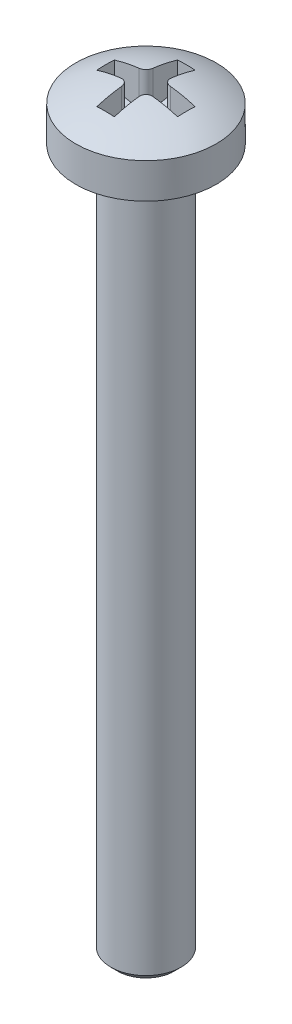
ISO-10303-21;
HEADER;
FILE_DESCRIPTION(('STEP AP214'),'2;1');
FILE_NAME('part.step','',(''),(''),'','','');
FILE_SCHEMA(('AUTOMOTIVE_DESIGN { 1 0 10303 214 1 1 1 1 }'));
ENDSEC;
DATA;
#1=APPLICATION_CONTEXT('core data for automotive mechanical design processes');
#2=APPLICATION_PROTOCOL_DEFINITION('international standard','automotive_design',2000,#1);
#3=PRODUCT_CONTEXT('',#1,'mechanical');
#4=PRODUCT('Part','Part','',(#3));
#5=PRODUCT_RELATED_PRODUCT_CATEGORY('part','',(#4));
#6=PRODUCT_DEFINITION_FORMATION('','',#4);
#7=PRODUCT_DEFINITION_CONTEXT('part definition',#1,'design');
#8=PRODUCT_DEFINITION('design','',#6,#7);
#9=PRODUCT_DEFINITION_SHAPE('','',#8);
#10=(LENGTH_UNIT() NAMED_UNIT(*) SI_UNIT(.MILLI.,.METRE.));
#11=(NAMED_UNIT(*) PLANE_ANGLE_UNIT() SI_UNIT($,.RADIAN.));
#12=(NAMED_UNIT(*) SI_UNIT($,.STERADIAN.) SOLID_ANGLE_UNIT());
#13=UNCERTAINTY_MEASURE_WITH_UNIT(LENGTH_MEASURE(1.E-05),#10,'distance_accuracy_value','');
#14=(GEOMETRIC_REPRESENTATION_CONTEXT(3) GLOBAL_UNCERTAINTY_ASSIGNED_CONTEXT((#13)) GLOBAL_UNIT_ASSIGNED_CONTEXT((#10,
#11,#12)) REPRESENTATION_CONTEXT('',''));
#15=CARTESIAN_POINT('',(0.,0.,0.));
#16=DIRECTION('',(0.,0.,1.));
#17=DIRECTION('',(1.,0.,0.));
#18=AXIS2_PLACEMENT_3D('',#15,#16,#17);
#19=CARTESIAN_POINT('',(2.00000000000001,-40.,0.));
#20=DIRECTION('',(0.,1.,0.));
#21=DIRECTION('',(0.,0.,1.));
#22=AXIS2_PLACEMENT_3D('',#19,#20,#21);
#23=PLANE('',#22);
#24=CARTESIAN_POINT('',(0.,-40.,0.));
#25=DIRECTION('',(0.,1.,0.));
#26=DIRECTION('',(0.,0.,1.));
#27=AXIS2_PLACEMENT_3D('',#24,#25,#26);
#28=CIRCLE('',#27,1.60000000000001);
#29=CARTESIAN_POINT('',(0.,-40.,1.60000000000001));
#30=VERTEX_POINT('',#29);
#31=EDGE_CURVE('E11',#30,#30,#28,.F.);
#32=ORIENTED_EDGE('',*,*,#31,.T.);
#33=EDGE_LOOP('',(#32));
#34=FACE_BOUND('',#33,.T.);
#35=ADVANCED_FACE('F39',(#34),#23,.F.);
#36=CARTESIAN_POINT('',(0.,-4.72272727272728,0.));
#37=DIRECTION('',(0.,1.,0.));
#38=DIRECTION('',(1.,0.,0.));
#39=AXIS2_PLACEMENT_3D('',#36,#37,#38);
#40=SPHERICAL_SURFACE('',#39,7.82272727272728);
#41=CARTESIAN_POINT('',(0.5,-4.72272727272728,0.));
#42=DIRECTION('',(1.,0.,0.));
#43=DIRECTION('',(0.,0.,-1.));
#44=AXIS2_PLACEMENT_3D('',#41,#42,#43);
#45=CIRCLE('',#44,7.80673183755348);
#46=CARTESIAN_POINT('',(0.5,2.73750476008987,-2.3));
#47=VERTEX_POINT('',#46);
#48=CARTESIAN_POINT('',(0.5,3.03195273249996,-0.9));
#49=VERTEX_POINT('',#48);
#50=EDGE_CURVE('E197',#47,#49,#45,.T.);
#51=ORIENTED_EDGE('',*,*,#50,.T.);
#52=CARTESIAN_POINT('',(0.5,3.03195273249996,-0.9));
#53=CARTESIAN_POINT('',(0.499980445653111,3.03454133641409,-0.877715199489853));
#54=CARTESIAN_POINT('',(0.501861325410847,3.0369109081898,-0.855406290685576));
#55=CARTESIAN_POINT('',(0.509308944557218,3.04115309750786,-0.811373363194762));
#56=CARTESIAN_POINT('',(0.514874142284133,3.04302592244948,-0.789649103823202));
#57=CARTESIAN_POINT('',(0.529581237998282,3.04621922226135,-0.747382590966706));
#58=CARTESIAN_POINT('',(0.538725894104163,3.0475392695665,-0.726841263013532));
#59=CARTESIAN_POINT('',(0.560335395409864,3.04958563422558,-0.687561895208892));
#60=CARTESIAN_POINT('',(0.572799188800053,3.05031213937239,-0.668823286645484));
#61=CARTESIAN_POINT('',(0.600596407799792,3.05114682561896,-0.633816736919395));
#62=CARTESIAN_POINT('',(0.615908512897499,3.05125942358876,-0.617531968951503));
#63=CARTESIAN_POINT('',(0.649026593510928,3.0508747494218,-0.587736528915892));
#64=CARTESIAN_POINT('',(0.666832948845617,3.05037738431157,-0.57422628012003));
#65=CARTESIAN_POINT('',(0.704363578386314,3.04879030089852,-0.550401537052683));
#66=CARTESIAN_POINT('',(0.724081674108829,3.04770244181268,-0.540077170971166));
#67=CARTESIAN_POINT('',(0.764919862434989,3.04496752601447,-0.522847557382613));
#68=CARTESIAN_POINT('',(0.786039420133905,3.04332068167708,-0.515941013789886));
#69=CARTESIAN_POINT('',(0.822714805755103,3.04007942212771,-0.5072274099574));
#70=CARTESIAN_POINT('',(0.838074093965798,3.03861284502167,-0.504517057384848));
#71=CARTESIAN_POINT('',(0.868957976534767,3.0354499847468,-0.500903202638105));
#72=CARTESIAN_POINT('',(0.88448230264661,3.03375403356009,-0.499997118337815));
#73=CARTESIAN_POINT('',(0.9,3.03195273249996,-0.5));
#74=B_SPLINE_CURVE_WITH_KNOTS('',3,(#52,#53,#54,#55,#56,#57,#58,#59,#60,#61,#62,#63,#64,#65,#66,
#67,#68,#69,#70,#71,#72,#73),.UNSPECIFIED.,.F.,.F.,(4,2,2,2,2,2,2,2,2,2,4),(0.,
0.0672224170043276,0.134416723302517,0.201662907801201,0.26888780779591,0.335628401088124,
0.402379168562592,0.468920974876219,0.535437528240593,0.582332561709017,0.629160434341086),.UNSPECIFIED.);
#75=CARTESIAN_POINT('',(0.9,3.03195273249996,-0.5));
#76=VERTEX_POINT('',#75);
#77=EDGE_CURVE('E259',#49,#76,#74,.T.);
#78=ORIENTED_EDGE('',*,*,#77,.T.);
#79=CARTESIAN_POINT('',(0.,-4.72272727272728,-0.5));
#80=DIRECTION('',(0.,0.,-1.));
#81=DIRECTION('',(-1.,0.,0.));
#82=AXIS2_PLACEMENT_3D('',#79,#80,#81);
#83=CIRCLE('',#82,7.80673183755348);
#84=CARTESIAN_POINT('',(2.3,2.73750476008987,-0.5));
#85=VERTEX_POINT('',#84);
#86=EDGE_CURVE('E195',#76,#85,#83,.T.);
#87=ORIENTED_EDGE('',*,*,#86,.T.);
#88=CARTESIAN_POINT('',(2.3,-4.72272727272728,0.));
#89=DIRECTION('',(1.,0.,0.));
#90=DIRECTION('',(0.,0.,-1.));
#91=AXIS2_PLACEMENT_3D('',#88,#89,#90);
#92=CIRCLE('',#91,7.47696876972688);
#93=CARTESIAN_POINT('',(2.3,2.73750476008987,0.5));
#94=VERTEX_POINT('',#93);
#95=EDGE_CURVE('E172',#85,#94,#92,.T.);
#96=ORIENTED_EDGE('',*,*,#95,.T.);
#97=CARTESIAN_POINT('',(0.,-4.72272727272728,0.5));
#98=DIRECTION('',(0.,0.,1.));
#99=DIRECTION('',(1.,0.,0.));
#100=AXIS2_PLACEMENT_3D('',#97,#98,#99);
#101=CIRCLE('',#100,7.80673183755348);
#102=CARTESIAN_POINT('',(0.9,3.03195273249996,0.5));
#103=VERTEX_POINT('',#102);
#104=EDGE_CURVE('E221',#94,#103,#101,.T.);
#105=ORIENTED_EDGE('',*,*,#104,.T.);
#106=CARTESIAN_POINT('',(0.9,3.03195273249996,0.5));
#107=CARTESIAN_POINT('',(0.877715199489853,3.03454133641409,0.499980445653111));
#108=CARTESIAN_POINT('',(0.855406290685576,3.0369109081898,0.501861325410847));
#109=CARTESIAN_POINT('',(0.811373363194762,3.04115309750786,0.509308944557218));
#110=CARTESIAN_POINT('',(0.789649103823202,3.04302592244948,0.514874142284133));
#111=CARTESIAN_POINT('',(0.747382590966706,3.04621922226135,0.529581237998282));
#112=CARTESIAN_POINT('',(0.726841263013532,3.0475392695665,0.538725894104163));
#113=CARTESIAN_POINT('',(0.687561895208891,3.04958563422558,0.560335395409864));
#114=CARTESIAN_POINT('',(0.668823286645484,3.05031213937239,0.572799188800053));
#115=CARTESIAN_POINT('',(0.633816736919395,3.05114682561896,0.600596407799792));
#116=CARTESIAN_POINT('',(0.617531968951503,3.05125942358877,0.6159085128975));
#117=CARTESIAN_POINT('',(0.587736528915892,3.0508747494218,0.649026593510929));
#118=CARTESIAN_POINT('',(0.57422628012003,3.05037738431157,0.666832948845617));
#119=CARTESIAN_POINT('',(0.550401537052683,3.04879030089852,0.704363578386314));
#120=CARTESIAN_POINT('',(0.540077170971166,3.04770244181268,0.724081674108829));
#121=CARTESIAN_POINT('',(0.522847557382613,3.04496752601447,0.764919862434989));
#122=CARTESIAN_POINT('',(0.515941013789886,3.04332068167708,0.786039420133905));
#123=CARTESIAN_POINT('',(0.5072274099574,3.04007942212771,0.822714805755103));
#124=CARTESIAN_POINT('',(0.504517057384848,3.03861284502167,0.838074093965798));
#125=CARTESIAN_POINT('',(0.500903202638105,3.03544998474679,0.868957976534767));
#126=CARTESIAN_POINT('',(0.499997118337815,3.03375403356009,0.884482302646609));
#127=CARTESIAN_POINT('',(0.5,3.03195273249996,0.9));
#128=B_SPLINE_CURVE_WITH_KNOTS('',3,(#106,#107,#108,#109,#110,#111,#112,#113,#114,#115,#116,
#117,#118,#119,#120,#121,#122,#123,#124,#125,#126,#127),.UNSPECIFIED.,.F.,.F.,(4,2,2,2,2,2,2,2,
2,2,4),(0.,0.0672224170043276,0.134416723302517,0.201662907801201,0.268887807795911,
0.335628401088124,0.402379168562592,0.468920974876219,0.535437528240593,0.582332561709017,
0.629160434341086),.UNSPECIFIED.);
#129=CARTESIAN_POINT('',(0.5,3.03195273249996,0.9));
#130=VERTEX_POINT('',#129);
#131=EDGE_CURVE('E254',#103,#130,#128,.T.);
#132=ORIENTED_EDGE('',*,*,#131,.T.);
#133=CARTESIAN_POINT('',(0.5,-4.72272727272728,0.));
#134=DIRECTION('',(1.,0.,0.));
#135=DIRECTION('',(0.,0.,-1.));
#136=AXIS2_PLACEMENT_3D('',#133,#134,#135);
#137=CIRCLE('',#136,7.80673183755348);
#138=CARTESIAN_POINT('',(0.5,2.73750476008987,2.3));
#139=VERTEX_POINT('',#138);
#140=EDGE_CURVE('E219',#130,#139,#137,.T.);
#141=ORIENTED_EDGE('',*,*,#140,.T.);
#142=CARTESIAN_POINT('',(0.,-4.72272727272728,2.3));
#143=DIRECTION('',(0.,0.,1.));
#144=DIRECTION('',(1.,0.,0.));
#145=AXIS2_PLACEMENT_3D('',#142,#143,#144);
#146=CIRCLE('',#145,7.47696876972688);
#147=CARTESIAN_POINT('',(-0.5,2.73750476008987,2.3));
#148=VERTEX_POINT('',#147);
#149=EDGE_CURVE('E216',#139,#148,#146,.T.);
#150=ORIENTED_EDGE('',*,*,#149,.T.);
#151=CARTESIAN_POINT('',(-0.5,-4.72272727272728,0.));
#152=DIRECTION('',(-1.,0.,0.));
#153=DIRECTION('',(0.,0.,1.));
#154=AXIS2_PLACEMENT_3D('',#151,#152,#153);
#155=CIRCLE('',#154,7.80673183755348);
#156=CARTESIAN_POINT('',(-0.5,3.03195273249996,0.9));
#157=VERTEX_POINT('',#156);
#158=EDGE_CURVE('E213',#148,#157,#155,.T.);
#159=ORIENTED_EDGE('',*,*,#158,.T.);
#160=CARTESIAN_POINT('',(-0.5,3.03195273249996,0.9));
#161=CARTESIAN_POINT('',(-0.499980445653111,3.03454133641409,0.877715199489853));
#162=CARTESIAN_POINT('',(-0.501861325410847,3.0369109081898,0.855406290685576));
#163=CARTESIAN_POINT('',(-0.509308944557218,3.04115309750786,0.811373363194762));
#164=CARTESIAN_POINT('',(-0.514874142284133,3.04302592244948,0.789649103823202));
#165=CARTESIAN_POINT('',(-0.529581237998282,3.04621922226135,0.747382590966706));
#166=CARTESIAN_POINT('',(-0.538725894104163,3.0475392695665,0.726841263013532));
#167=CARTESIAN_POINT('',(-0.560335395409864,3.04958563422558,0.687561895208892));
#168=CARTESIAN_POINT('',(-0.572799188800053,3.05031213937239,0.668823286645484));
#169=CARTESIAN_POINT('',(-0.600596407799792,3.05114682561896,0.633816736919395));
#170=CARTESIAN_POINT('',(-0.6159085128975,3.05125942358876,0.617531968951503));
#171=CARTESIAN_POINT('',(-0.649026593510929,3.0508747494218,0.587736528915892));
#172=CARTESIAN_POINT('',(-0.666832948845617,3.05037738431157,0.57422628012003));
#173=CARTESIAN_POINT('',(-0.704363578386314,3.04879030089852,0.550401537052683));
#174=CARTESIAN_POINT('',(-0.724081674108829,3.04770244181268,0.540077170971166));
#175=CARTESIAN_POINT('',(-0.764919862434989,3.04496752601447,0.522847557382613));
#176=CARTESIAN_POINT('',(-0.786039420133905,3.04332068167708,0.515941013789887));
#177=CARTESIAN_POINT('',(-0.822714805755103,3.04007942212771,0.5072274099574));
#178=CARTESIAN_POINT('',(-0.838074093965798,3.03861284502167,0.504517057384848));
#179=CARTESIAN_POINT('',(-0.868957976534767,3.0354499847468,0.500903202638105));
#180=CARTESIAN_POINT('',(-0.88448230264661,3.03375403356009,0.499997118337815));
#181=CARTESIAN_POINT('',(-0.9,3.03195273249996,0.5));
#182=B_SPLINE_CURVE_WITH_KNOTS('',3,(#160,#161,#162,#163,#164,#165,#166,#167,#168,#169,#170,
#171,#172,#173,#174,#175,#176,#177,#178,#179,#180,#181),.UNSPECIFIED.,.F.,.F.,(4,2,2,2,2,2,2,2,
2,2,4),(0.,0.0672224170043276,0.134416723302517,0.201662907801201,0.26888780779591,
0.335628401088124,0.402379168562592,0.468920974876219,0.535437528240592,0.582332561709017,
0.629160434341086),.UNSPECIFIED.);
#183=CARTESIAN_POINT('',(-0.9,3.03195273249996,0.5));
#184=VERTEX_POINT('',#183);
#185=EDGE_CURVE('E233',#157,#184,#182,.T.);
#186=ORIENTED_EDGE('',*,*,#185,.T.);
#187=CARTESIAN_POINT('',(0.,-4.72272727272728,0.5));
#188=DIRECTION('',(0.,0.,1.));
#189=DIRECTION('',(1.,0.,0.));
#190=AXIS2_PLACEMENT_3D('',#187,#188,#189);
#191=CIRCLE('',#190,7.80673183755348);
#192=CARTESIAN_POINT('',(-2.3,2.73750476008987,0.5));
#193=VERTEX_POINT('',#192);
#194=EDGE_CURVE('E211',#184,#193,#191,.T.);
#195=ORIENTED_EDGE('',*,*,#194,.T.);
#196=CARTESIAN_POINT('',(-2.3,-4.72272727272728,0.));
#197=DIRECTION('',(-1.,0.,0.));
#198=DIRECTION('',(0.,0.,1.));
#199=AXIS2_PLACEMENT_3D('',#196,#197,#198);
#200=CIRCLE('',#199,7.47696876972688);
#201=CARTESIAN_POINT('',(-2.3,2.73750476008987,-0.5));
#202=VERTEX_POINT('',#201);
#203=EDGE_CURVE('E208',#193,#202,#200,.T.);
#204=ORIENTED_EDGE('',*,*,#203,.T.);
#205=CARTESIAN_POINT('',(0.,-4.72272727272728,-0.5));
#206=DIRECTION('',(0.,0.,-1.));
#207=DIRECTION('',(-1.,0.,0.));
#208=AXIS2_PLACEMENT_3D('',#205,#206,#207);
#209=CIRCLE('',#208,7.80673183755348);
#210=CARTESIAN_POINT('',(-0.9,3.03195273249996,-0.5));
#211=VERTEX_POINT('',#210);
#212=EDGE_CURVE('E205',#202,#211,#209,.T.);
#213=ORIENTED_EDGE('',*,*,#212,.T.);
#214=CARTESIAN_POINT('',(-0.9,3.03195273249996,-0.5));
#215=CARTESIAN_POINT('',(-0.877715199489853,3.03454133641409,-0.499980445653111));
#216=CARTESIAN_POINT('',(-0.855406290685576,3.0369109081898,-0.501861325410847));
#217=CARTESIAN_POINT('',(-0.811373363194762,3.04115309750786,-0.509308944557218));
#218=CARTESIAN_POINT('',(-0.789649103823202,3.04302592244948,-0.514874142284133));
#219=CARTESIAN_POINT('',(-0.747382590966706,3.04621922226135,-0.529581237998282));
#220=CARTESIAN_POINT('',(-0.726841263013532,3.0475392695665,-0.538725894104163));
#221=CARTESIAN_POINT('',(-0.687561895208892,3.04958563422558,-0.560335395409864));
#222=CARTESIAN_POINT('',(-0.668823286645484,3.05031213937239,-0.572799188800053));
#223=CARTESIAN_POINT('',(-0.633816736919395,3.05114682561896,-0.600596407799792));
#224=CARTESIAN_POINT('',(-0.617531968951503,3.05125942358877,-0.6159085128975));
#225=CARTESIAN_POINT('',(-0.587736528915892,3.0508747494218,-0.649026593510929));
#226=CARTESIAN_POINT('',(-0.57422628012003,3.05037738431157,-0.666832948845617));
#227=CARTESIAN_POINT('',(-0.550401537052683,3.04879030089852,-0.704363578386314));
#228=CARTESIAN_POINT('',(-0.540077170971166,3.04770244181268,-0.724081674108829));
#229=CARTESIAN_POINT('',(-0.522847557382613,3.04496752601447,-0.764919862434989));
#230=CARTESIAN_POINT('',(-0.515941013789887,3.04332068167708,-0.786039420133905));
#231=CARTESIAN_POINT('',(-0.5072274099574,3.04007942212771,-0.822714805755103));
#232=CARTESIAN_POINT('',(-0.504517057384848,3.03861284502167,-0.838074093965798));
#233=CARTESIAN_POINT('',(-0.500903202638105,3.03544998474679,-0.868957976534767));
#234=CARTESIAN_POINT('',(-0.499997118337815,3.03375403356009,-0.88448230264661));
#235=CARTESIAN_POINT('',(-0.5,3.03195273249996,-0.9));
#236=B_SPLINE_CURVE_WITH_KNOTS('',3,(#214,#215,#216,#217,#218,#219,#220,#221,#222,#223,#224,
#225,#226,#227,#228,#229,#230,#231,#232,#233,#234,#235),.UNSPECIFIED.,.F.,.F.,(4,2,2,2,2,2,2,2,
2,2,4),(0.,0.0672224170043276,0.134416723302517,0.201662907801201,0.268887807795911,
0.335628401088124,0.402379168562592,0.468920974876219,0.535437528240593,0.582332561709018,
0.629160434341086),.UNSPECIFIED.);
#237=CARTESIAN_POINT('',(-0.5,3.03195273249996,-0.9));
#238=VERTEX_POINT('',#237);
#239=EDGE_CURVE('E227',#211,#238,#236,.T.);
#240=ORIENTED_EDGE('',*,*,#239,.T.);
#241=CARTESIAN_POINT('',(-0.5,-4.72272727272728,0.));
#242=DIRECTION('',(-1.,0.,0.));
#243=DIRECTION('',(0.,0.,1.));
#244=AXIS2_PLACEMENT_3D('',#241,#242,#243);
#245=CIRCLE('',#244,7.80673183755348);
#246=CARTESIAN_POINT('',(-0.5,2.73750476008987,-2.3));
#247=VERTEX_POINT('',#246);
#248=EDGE_CURVE('E203',#238,#247,#245,.T.);
#249=ORIENTED_EDGE('',*,*,#248,.T.);
#250=CARTESIAN_POINT('',(0.,-4.72272727272728,-2.3));
#251=DIRECTION('',(0.,0.,-1.));
#252=DIRECTION('',(-1.,0.,0.));
#253=AXIS2_PLACEMENT_3D('',#250,#251,#252);
#254=CIRCLE('',#253,7.47696876972688);
#255=EDGE_CURVE('E200',#247,#47,#254,.T.);
#256=ORIENTED_EDGE('',*,*,#255,.T.);
#257=EDGE_LOOP('',(#51,#78,#87,#96,#105,#132,#141,#150,#159,#186,#195,#204,#213,#240,#249,#256));
#258=FACE_BOUND('',#257,.T.);
#259=CARTESIAN_POINT('',(0.,2.,0.));
#260=DIRECTION('',(0.,1.,0.));
#261=DIRECTION('',(0.,0.,1.));
#262=AXIS2_PLACEMENT_3D('',#259,#260,#261);
#263=CIRCLE('',#262,4.);
#264=CARTESIAN_POINT('',(0.,2.,4.));
#265=VERTEX_POINT('',#264);
#266=EDGE_CURVE('E191',#265,#265,#263,.T.);
#267=ORIENTED_EDGE('',*,*,#266,.T.);
#268=EDGE_LOOP('',(#267));
#269=FACE_BOUND('',#268,.T.);
#270=ADVANCED_FACE('F241',(#258,#269),#40,.T.);
#271=CARTESIAN_POINT('',(0.,3.1,0.));
#272=DIRECTION('',(0.,1.,0.));
#273=DIRECTION('',(0.,0.,1.));
#274=AXIS2_PLACEMENT_3D('',#271,#272,#273);
#275=CYLINDRICAL_SURFACE('',#274,4.);
#276=ORIENTED_EDGE('',*,*,#266,.F.);
#277=EDGE_LOOP('',(#276));
#278=FACE_BOUND('',#277,.T.);
#279=CARTESIAN_POINT('',(0.,0.,0.));
#280=DIRECTION('',(0.,1.,0.));
#281=DIRECTION('',(0.,0.,1.));
#282=AXIS2_PLACEMENT_3D('',#279,#280,#281);
#283=CIRCLE('',#282,4.);
#284=CARTESIAN_POINT('',(0.,0.,4.));
#285=VERTEX_POINT('',#284);
#286=EDGE_CURVE('E183',#285,#285,#283,.T.);
#287=ORIENTED_EDGE('',*,*,#286,.T.);
#288=EDGE_LOOP('',(#287));
#289=FACE_BOUND('',#288,.T.);
#290=ADVANCED_FACE('F246',(#278,#289),#275,.T.);
#291=CARTESIAN_POINT('',(4.,0.,0.));
#292=DIRECTION('',(0.,1.,0.));
#293=DIRECTION('',(0.,0.,1.));
#294=AXIS2_PLACEMENT_3D('',#291,#292,#293);
#295=PLANE('',#294);
#296=ORIENTED_EDGE('',*,*,#286,.F.);
#297=EDGE_LOOP('',(#296));
#298=FACE_BOUND('',#297,.T.);
#299=CARTESIAN_POINT('',(0.,0.,0.));
#300=DIRECTION('',(0.,1.,0.));
#301=DIRECTION('',(0.,0.,1.));
#302=AXIS2_PLACEMENT_3D('',#299,#300,#301);
#303=CIRCLE('',#302,2.);
#304=CARTESIAN_POINT('',(0.,0.,2.));
#305=VERTEX_POINT('',#304);
#306=EDGE_CURVE('E180',#305,#305,#303,.T.);
#307=ORIENTED_EDGE('',*,*,#306,.T.);
#308=EDGE_LOOP('',(#307));
#309=FACE_BOUND('',#308,.T.);
#310=ADVANCED_FACE('F333',(#298,#309),#295,.F.);
#311=CARTESIAN_POINT('',(0.,3.1,0.));
#312=DIRECTION('',(0.,1.,0.));
#313=DIRECTION('',(0.,0.,1.));
#314=AXIS2_PLACEMENT_3D('',#311,#312,#313);
#315=CYLINDRICAL_SURFACE('',#314,2.);
#316=CARTESIAN_POINT('',(0.,-39.6,0.));
#317=DIRECTION('',(0.,1.,0.));
#318=DIRECTION('',(0.,0.,1.));
#319=AXIS2_PLACEMENT_3D('',#316,#317,#318);
#320=CIRCLE('',#319,2.);
#321=CARTESIAN_POINT('',(0.,-39.6,2.));
#322=VERTEX_POINT('',#321);
#323=EDGE_CURVE('E47',#322,#322,#320,.T.);
#324=ORIENTED_EDGE('',*,*,#323,.T.);
#325=EDGE_LOOP('',(#324));
#326=FACE_BOUND('',#325,.T.);
#327=ORIENTED_EDGE('',*,*,#306,.F.);
#328=EDGE_LOOP('',(#327));
#329=FACE_BOUND('',#328,.T.);
#330=ADVANCED_FACE('F305',(#326,#329),#315,.T.);
#331=CARTESIAN_POINT('',(0.5,-40.001,0.5));
#332=DIRECTION('',(0.,0.,1.));
#333=DIRECTION('',(1.,0.,0.));
#334=AXIS2_PLACEMENT_3D('',#331,#332,#333);
#335=PLANE('',#334);
#336=CARTESIAN_POINT('',(0.,9.49999999999998,0.5));
#337=DIRECTION('',(0.,0.,1.));
#338=DIRECTION('',(1.,0.,0.));
#339=AXIS2_PLACEMENT_3D('',#336,#337,#338);
#340=CIRCLE('',#339,8.48528137423855);
#341=CARTESIAN_POINT('',(2.3,1.3323810079069,0.5));
#342=VERTEX_POINT('',#341);
#343=CARTESIAN_POINT('',(0.9,1.06258333374486,0.5));
#344=VERTEX_POINT('',#343);
#345=EDGE_CURVE('E178',#342,#344,#340,.F.);
#346=ORIENTED_EDGE('',*,*,#345,.T.);
#347=DIRECTION('',(0.,1.,0.));
#348=VECTOR('',#347,1.);
#349=CARTESIAN_POINT('',(0.9,-40.001,0.5));
#350=LINE('',#349,#348);
#351=EDGE_CURVE('E558',#344,#103,#350,.T.);
#352=ORIENTED_EDGE('',*,*,#351,.T.);
#353=ORIENTED_EDGE('',*,*,#104,.F.);
#354=DIRECTION('',(0.,1.,0.));
#355=VECTOR('',#354,1.);
#356=CARTESIAN_POINT('',(2.3,-40.001,0.5));
#357=LINE('',#356,#355);
#358=EDGE_CURVE('E174',#342,#94,#357,.T.);
#359=ORIENTED_EDGE('',*,*,#358,.F.);
#360=EDGE_LOOP('',(#346,#352,#353,#359));
#361=FACE_BOUND('',#360,.T.);
#362=ADVANCED_FACE('F346',(#361),#335,.F.);
#363=CARTESIAN_POINT('',(0.5,-40.001,0.5));
#364=DIRECTION('',(1.,0.,0.));
#365=DIRECTION('',(0.,0.,-1.));
#366=AXIS2_PLACEMENT_3D('',#363,#364,#365);
#367=PLANE('',#366);
#368=ORIENTED_EDGE('',*,*,#140,.F.);
#369=DIRECTION('',(0.,1.,0.));
#370=VECTOR('',#369,1.);
#371=CARTESIAN_POINT('',(0.5,-40.001,0.9));
#372=LINE('',#371,#370);
#373=CARTESIAN_POINT('',(0.5,1.06258333374486,0.9));
#374=VERTEX_POINT('',#373);
#375=EDGE_CURVE('E556',#130,#374,#372,.F.);
#376=ORIENTED_EDGE('',*,*,#375,.T.);
#377=CARTESIAN_POINT('',(0.5,9.49999999999998,0.));
#378=DIRECTION('',(1.,0.,0.));
#379=DIRECTION('',(0.,0.,-1.));
#380=AXIS2_PLACEMENT_3D('',#377,#378,#379);
#381=CIRCLE('',#380,8.48528137423855);
#382=CARTESIAN_POINT('',(0.5,1.3323810079069,2.3));
#383=VERTEX_POINT('',#382);
#384=EDGE_CURVE('E185',#374,#383,#381,.F.);
#385=ORIENTED_EDGE('',*,*,#384,.T.);
#386=DIRECTION('',(0.,1.,0.));
#387=VECTOR('',#386,1.);
#388=CARTESIAN_POINT('',(0.5,-40.001,2.3));
#389=LINE('',#388,#387);
#390=EDGE_CURVE('E164',#383,#139,#389,.T.);
#391=ORIENTED_EDGE('',*,*,#390,.T.);
#392=EDGE_LOOP('',(#368,#376,#385,#391));
#393=FACE_BOUND('',#392,.T.);
#394=ADVANCED_FACE('F294',(#393),#367,.F.);
#395=CARTESIAN_POINT('',(-0.5,-40.001,2.3));
#396=DIRECTION('',(0.,0.,1.));
#397=DIRECTION('',(1.,0.,0.));
#398=AXIS2_PLACEMENT_3D('',#395,#396,#397);
#399=PLANE('',#398);
#400=ORIENTED_EDGE('',*,*,#390,.F.);
#401=CARTESIAN_POINT('',(0.,9.49999999999998,2.3));
#402=DIRECTION('',(0.,0.,1.));
#403=DIRECTION('',(1.,0.,0.));
#404=AXIS2_PLACEMENT_3D('',#401,#402,#403);
#405=CIRCLE('',#404,8.18290901819149);
#406=CARTESIAN_POINT('',(-0.5,1.3323810079069,2.3));
#407=VERTEX_POINT('',#406);
#408=EDGE_CURVE('E520',#383,#407,#405,.F.);
#409=ORIENTED_EDGE('',*,*,#408,.T.);
#410=DIRECTION('',(0.,1.,0.));
#411=VECTOR('',#410,1.);
#412=CARTESIAN_POINT('',(-0.5,-40.001,2.3));
#413=LINE('',#412,#411);
#414=EDGE_CURVE('E519',#407,#148,#413,.T.);
#415=ORIENTED_EDGE('',*,*,#414,.T.);
#416=ORIENTED_EDGE('',*,*,#149,.F.);
#417=EDGE_LOOP('',(#400,#409,#415,#416));
#418=FACE_BOUND('',#417,.T.);
#419=ADVANCED_FACE('F359',(#418),#399,.F.);
#420=CARTESIAN_POINT('',(-0.5,-40.001,0.5));
#421=DIRECTION('',(-1.,0.,0.));
#422=DIRECTION('',(0.,0.,1.));
#423=AXIS2_PLACEMENT_3D('',#420,#421,#422);
#424=PLANE('',#423);
#425=CARTESIAN_POINT('',(-0.5,9.49999999999998,0.));
#426=DIRECTION('',(-1.,0.,0.));
#427=DIRECTION('',(0.,0.,1.));
#428=AXIS2_PLACEMENT_3D('',#425,#426,#427);
#429=CIRCLE('',#428,8.48528137423855);
#430=CARTESIAN_POINT('',(-0.5,1.06258333374486,0.9));
#431=VERTEX_POINT('',#430);
#432=EDGE_CURVE('E514',#407,#431,#429,.F.);
#433=ORIENTED_EDGE('',*,*,#432,.T.);
#434=DIRECTION('',(0.,1.,0.));
#435=VECTOR('',#434,1.);
#436=CARTESIAN_POINT('',(-0.5,-40.001,0.9));
#437=LINE('',#436,#435);
#438=EDGE_CURVE('E509',#431,#157,#437,.T.);
#439=ORIENTED_EDGE('',*,*,#438,.T.);
#440=ORIENTED_EDGE('',*,*,#158,.F.);
#441=ORIENTED_EDGE('',*,*,#414,.F.);
#442=EDGE_LOOP('',(#433,#439,#440,#441));
#443=FACE_BOUND('',#442,.T.);
#444=ADVANCED_FACE('F366',(#443),#424,.F.);
#445=CARTESIAN_POINT('',(-2.3,-40.001,0.5));
#446=DIRECTION('',(0.,0.,1.));
#447=DIRECTION('',(1.,0.,0.));
#448=AXIS2_PLACEMENT_3D('',#445,#446,#447);
#449=PLANE('',#448);
#450=ORIENTED_EDGE('',*,*,#194,.F.);
#451=DIRECTION('',(0.,1.,0.));
#452=VECTOR('',#451,1.);
#453=CARTESIAN_POINT('',(-0.9,-40.001,0.5));
#454=LINE('',#453,#452);
#455=CARTESIAN_POINT('',(-0.9,1.06258333374486,0.5));
#456=VERTEX_POINT('',#455);
#457=EDGE_CURVE('E507',#184,#456,#454,.F.);
#458=ORIENTED_EDGE('',*,*,#457,.T.);
#459=CARTESIAN_POINT('',(0.,9.49999999999998,0.5));
#460=DIRECTION('',(0.,0.,1.));
#461=DIRECTION('',(1.,0.,0.));
#462=AXIS2_PLACEMENT_3D('',#459,#460,#461);
#463=CIRCLE('',#462,8.48528137423855);
#464=CARTESIAN_POINT('',(-2.3,1.3323810079069,0.5));
#465=VERTEX_POINT('',#464);
#466=EDGE_CURVE('E517',#456,#465,#463,.F.);
#467=ORIENTED_EDGE('',*,*,#466,.T.);
#468=DIRECTION('',(0.,1.,0.));
#469=VECTOR('',#468,1.);
#470=CARTESIAN_POINT('',(-2.3,-40.001,0.5));
#471=LINE('',#470,#469);
#472=EDGE_CURVE('E531',#465,#193,#471,.T.);
#473=ORIENTED_EDGE('',*,*,#472,.T.);
#474=EDGE_LOOP('',(#450,#458,#467,#473));
#475=FACE_BOUND('',#474,.T.);
#476=ADVANCED_FACE('F373',(#475),#449,.F.);
#477=CARTESIAN_POINT('',(-2.3,-40.001,-0.5));
#478=DIRECTION('',(-1.,0.,0.));
#479=DIRECTION('',(0.,0.,1.));
#480=AXIS2_PLACEMENT_3D('',#477,#478,#479);
#481=PLANE('',#480);
#482=ORIENTED_EDGE('',*,*,#472,.F.);
#483=CARTESIAN_POINT('',(-2.3,9.49999999999998,0.));
#484=DIRECTION('',(-1.,0.,0.));
#485=DIRECTION('',(0.,0.,1.));
#486=AXIS2_PLACEMENT_3D('',#483,#484,#485);
#487=CIRCLE('',#486,8.18290901819149);
#488=CARTESIAN_POINT('',(-2.3,1.3323810079069,-0.5));
#489=VERTEX_POINT('',#488);
#490=EDGE_CURVE('E523',#465,#489,#487,.F.);
#491=ORIENTED_EDGE('',*,*,#490,.T.);
#492=DIRECTION('',(0.,1.,0.));
#493=VECTOR('',#492,1.);
#494=CARTESIAN_POINT('',(-2.3,-40.001,-0.5));
#495=LINE('',#494,#493);
#496=EDGE_CURVE('E534',#489,#202,#495,.T.);
#497=ORIENTED_EDGE('',*,*,#496,.T.);
#498=ORIENTED_EDGE('',*,*,#203,.F.);
#499=EDGE_LOOP('',(#482,#491,#497,#498));
#500=FACE_BOUND('',#499,.T.);
#501=ADVANCED_FACE('F381',(#500),#481,.F.);
#502=CARTESIAN_POINT('',(-2.3,-40.001,-0.5));
#503=DIRECTION('',(0.,0.,-1.));
#504=DIRECTION('',(-1.,0.,0.));
#505=AXIS2_PLACEMENT_3D('',#502,#503,#504);
#506=PLANE('',#505);
#507=CARTESIAN_POINT('',(0.,9.49999999999998,-0.5));
#508=DIRECTION('',(0.,0.,-1.));
#509=DIRECTION('',(-1.,0.,0.));
#510=AXIS2_PLACEMENT_3D('',#507,#508,#509);
#511=CIRCLE('',#510,8.48528137423855);
#512=CARTESIAN_POINT('',(-0.9,1.06258333374486,-0.5));
#513=VERTEX_POINT('',#512);
#514=EDGE_CURVE('E566',#489,#513,#511,.F.);
#515=ORIENTED_EDGE('',*,*,#514,.T.);
#516=DIRECTION('',(0.,1.,0.));
#517=VECTOR('',#516,1.);
#518=CARTESIAN_POINT('',(-0.9,-40.001,-0.5));
#519=LINE('',#518,#517);
#520=EDGE_CURVE('E551',#513,#211,#519,.T.);
#521=ORIENTED_EDGE('',*,*,#520,.T.);
#522=ORIENTED_EDGE('',*,*,#212,.F.);
#523=ORIENTED_EDGE('',*,*,#496,.F.);
#524=EDGE_LOOP('',(#515,#521,#522,#523));
#525=FACE_BOUND('',#524,.T.);
#526=ADVANCED_FACE('F389',(#525),#506,.F.);
#527=CARTESIAN_POINT('',(-0.5,-40.001,-2.3));
#528=DIRECTION('',(-1.,0.,0.));
#529=DIRECTION('',(0.,0.,1.));
#530=AXIS2_PLACEMENT_3D('',#527,#528,#529);
#531=PLANE('',#530);
#532=ORIENTED_EDGE('',*,*,#248,.F.);
#533=DIRECTION('',(0.,1.,0.));
#534=VECTOR('',#533,1.);
#535=CARTESIAN_POINT('',(-0.5,-40.001,-0.9));
#536=LINE('',#535,#534);
#537=CARTESIAN_POINT('',(-0.5,1.06258333374486,-0.9));
#538=VERTEX_POINT('',#537);
#539=EDGE_CURVE('E54',#238,#538,#536,.F.);
#540=ORIENTED_EDGE('',*,*,#539,.T.);
#541=CARTESIAN_POINT('',(-0.5,9.49999999999998,0.));
#542=DIRECTION('',(-1.,0.,0.));
#543=DIRECTION('',(0.,0.,1.));
#544=AXIS2_PLACEMENT_3D('',#541,#542,#543);
#545=CIRCLE('',#544,8.48528137423855);
#546=CARTESIAN_POINT('',(-0.5,1.3323810079069,-2.3));
#547=VERTEX_POINT('',#546);
#548=EDGE_CURVE('E562',#538,#547,#545,.F.);
#549=ORIENTED_EDGE('',*,*,#548,.T.);
#550=DIRECTION('',(0.,1.,0.));
#551=VECTOR('',#550,1.);
#552=CARTESIAN_POINT('',(-0.5,-40.001,-2.3));
#553=LINE('',#552,#551);
#554=EDGE_CURVE('E537',#547,#247,#553,.T.);
#555=ORIENTED_EDGE('',*,*,#554,.T.);
#556=EDGE_LOOP('',(#532,#540,#549,#555));
#557=FACE_BOUND('',#556,.T.);
#558=ADVANCED_FACE('F397',(#557),#531,.F.);
#559=CARTESIAN_POINT('',(-0.5,-40.001,-2.3));
#560=DIRECTION('',(0.,0.,-1.));
#561=DIRECTION('',(-1.,0.,0.));
#562=AXIS2_PLACEMENT_3D('',#559,#560,#561);
#563=PLANE('',#562);
#564=ORIENTED_EDGE('',*,*,#554,.F.);
#565=CARTESIAN_POINT('',(0.,9.49999999999998,-2.3));
#566=DIRECTION('',(0.,0.,-1.));
#567=DIRECTION('',(-1.,0.,0.));
#568=AXIS2_PLACEMENT_3D('',#565,#566,#567);
#569=CIRCLE('',#568,8.18290901819149);
#570=CARTESIAN_POINT('',(0.5,1.3323810079069,-2.3));
#571=VERTEX_POINT('',#570);
#572=EDGE_CURVE('E545',#547,#571,#569,.F.);
#573=ORIENTED_EDGE('',*,*,#572,.T.);
#574=DIRECTION('',(0.,1.,0.));
#575=VECTOR('',#574,1.);
#576=CARTESIAN_POINT('',(0.5,-40.001,-2.3));
#577=LINE('',#576,#575);
#578=EDGE_CURVE('E173',#571,#47,#577,.T.);
#579=ORIENTED_EDGE('',*,*,#578,.T.);
#580=ORIENTED_EDGE('',*,*,#255,.F.);
#581=EDGE_LOOP('',(#564,#573,#579,#580));
#582=FACE_BOUND('',#581,.T.);
#583=ADVANCED_FACE('F405',(#582),#563,.F.);
#584=CARTESIAN_POINT('',(0.5,-40.001,-2.3));
#585=DIRECTION('',(1.,0.,0.));
#586=DIRECTION('',(0.,0.,-1.));
#587=AXIS2_PLACEMENT_3D('',#584,#585,#586);
#588=PLANE('',#587);
#589=CARTESIAN_POINT('',(0.5,9.49999999999998,0.));
#590=DIRECTION('',(1.,0.,0.));
#591=DIRECTION('',(0.,0.,-1.));
#592=AXIS2_PLACEMENT_3D('',#589,#590,#591);
#593=CIRCLE('',#592,8.48528137423855);
#594=CARTESIAN_POINT('',(0.5,1.06258333374486,-0.9));
#595=VERTEX_POINT('',#594);
#596=EDGE_CURVE('E163',#571,#595,#593,.F.);
#597=ORIENTED_EDGE('',*,*,#596,.T.);
#598=DIRECTION('',(0.,1.,0.));
#599=VECTOR('',#598,1.);
#600=CARTESIAN_POINT('',(0.5,-40.001,-0.9));
#601=LINE('',#600,#599);
#602=EDGE_CURVE('E224',#595,#49,#601,.T.);
#603=ORIENTED_EDGE('',*,*,#602,.T.);
#604=ORIENTED_EDGE('',*,*,#50,.F.);
#605=ORIENTED_EDGE('',*,*,#578,.F.);
#606=EDGE_LOOP('',(#597,#603,#604,#605));
#607=FACE_BOUND('',#606,.T.);
#608=ADVANCED_FACE('F412',(#607),#588,.F.);
#609=CARTESIAN_POINT('',(0.5,-40.001,-0.5));
#610=DIRECTION('',(0.,0.,-1.));
#611=DIRECTION('',(-1.,0.,0.));
#612=AXIS2_PLACEMENT_3D('',#609,#610,#611);
#613=PLANE('',#612);
#614=ORIENTED_EDGE('',*,*,#86,.F.);
#615=DIRECTION('',(0.,1.,0.));
#616=VECTOR('',#615,1.);
#617=CARTESIAN_POINT('',(0.9,-40.001,-0.5));
#618=LINE('',#617,#616);
#619=CARTESIAN_POINT('',(0.9,1.06258333374486,-0.5));
#620=VERTEX_POINT('',#619);
#621=EDGE_CURVE('E160',#76,#620,#618,.F.);
#622=ORIENTED_EDGE('',*,*,#621,.T.);
#623=CARTESIAN_POINT('',(0.,9.49999999999998,-0.5));
#624=DIRECTION('',(0.,0.,-1.));
#625=DIRECTION('',(-1.,0.,0.));
#626=AXIS2_PLACEMENT_3D('',#623,#624,#625);
#627=CIRCLE('',#626,8.48528137423855);
#628=CARTESIAN_POINT('',(2.3,1.3323810079069,-0.5));
#629=VERTEX_POINT('',#628);
#630=EDGE_CURVE('E154',#620,#629,#627,.F.);
#631=ORIENTED_EDGE('',*,*,#630,.T.);
#632=DIRECTION('',(0.,1.,0.));
#633=VECTOR('',#632,1.);
#634=CARTESIAN_POINT('',(2.3,-40.001,-0.5));
#635=LINE('',#634,#633);
#636=EDGE_CURVE('E158',#629,#85,#635,.T.);
#637=ORIENTED_EDGE('',*,*,#636,.T.);
#638=EDGE_LOOP('',(#614,#622,#631,#637));
#639=FACE_BOUND('',#638,.T.);
#640=ADVANCED_FACE('F157',(#639),#613,.F.);
#641=CARTESIAN_POINT('',(2.3,-40.001,-0.5));
#642=DIRECTION('',(1.,0.,0.));
#643=DIRECTION('',(0.,0.,-1.));
#644=AXIS2_PLACEMENT_3D('',#641,#642,#643);
#645=PLANE('',#644);
#646=ORIENTED_EDGE('',*,*,#636,.F.);
#647=CARTESIAN_POINT('',(2.3,9.49999999999998,0.));
#648=DIRECTION('',(1.,0.,0.));
#649=DIRECTION('',(0.,0.,-1.));
#650=AXIS2_PLACEMENT_3D('',#647,#648,#649);
#651=CIRCLE('',#650,8.18290901819149);
#652=EDGE_CURVE('E169',#629,#342,#651,.F.);
#653=ORIENTED_EDGE('',*,*,#652,.T.);
#654=ORIENTED_EDGE('',*,*,#358,.T.);
#655=ORIENTED_EDGE('',*,*,#95,.F.);
#656=EDGE_LOOP('',(#646,#653,#654,#655));
#657=FACE_BOUND('',#656,.T.);
#658=ADVANCED_FACE('F168',(#657),#645,.F.);
#659=CARTESIAN_POINT('',(0.,9.49999999999998,0.));
#660=DIRECTION('',(0.,1.,0.));
#661=DIRECTION('',(1.,0.,0.));
#662=AXIS2_PLACEMENT_3D('',#659,#660,#661);
#663=SPHERICAL_SURFACE('',#662,8.49999999999998);
#664=ORIENTED_EDGE('',*,*,#345,.F.);
#665=ORIENTED_EDGE('',*,*,#652,.F.);
#666=ORIENTED_EDGE('',*,*,#630,.F.);
#667=CARTESIAN_POINT('',(0.9,1.06258333374486,-0.5));
#668=CARTESIAN_POINT('',(0.877681895176581,1.06020064583187,-0.499980506377996));
#669=CARTESIAN_POINT('',(0.855344205727362,1.0580201488652,-0.501866869905914));
#670=CARTESIAN_POINT('',(0.811264196369215,1.05411756501269,-0.509332340473144));
#671=CARTESIAN_POINT('',(0.78952159882242,1.05239526097159,-0.514909693823375));
#672=CARTESIAN_POINT('',(0.747228556255667,1.04945966047884,-0.529643735623788));
#673=CARTESIAN_POINT('',(0.726678990033897,1.04824673524169,-0.538803025087882));
#674=CARTESIAN_POINT('',(0.687389852539137,1.04636746374655,-0.560442280349619));
#675=CARTESIAN_POINT('',(0.668649749482246,1.04570095646757,-0.572921266446781));
#676=CARTESIAN_POINT('',(0.633625729643449,1.04493649451643,-0.600763861630353));
#677=CARTESIAN_POINT('',(0.617327507926939,1.04483509156346,-0.616109383561911));
#678=CARTESIAN_POINT('',(0.587514637710959,1.04519463942213,-0.649299998886555));
#679=CARTESIAN_POINT('',(0.574000432084661,1.04565567962496,-0.667145489209941));
#680=CARTESIAN_POINT('',(0.55017165377276,1.04712438551599,-0.704769667803527));
#681=CARTESIAN_POINT('',(0.539848822620757,1.04813062146146,-0.724543189195622));
#682=CARTESIAN_POINT('',(0.522637980126425,1.05065941614313,-0.765498290560969));
#683=CARTESIAN_POINT('',(0.515748559609182,1.05218176262027,-0.78667928881133));
#684=CARTESIAN_POINT('',(0.507116958212197,1.05516459963325,-0.823303350164225));
#685=CARTESIAN_POINT('',(0.504448298653858,1.05650461680506,-0.838544928463922));
#686=CARTESIAN_POINT('',(0.500889732891837,1.05939256924764,-0.869192646434852));
#687=CARTESIAN_POINT('',(0.499997287547255,1.06094020433808,-0.884598519500552));
#688=CARTESIAN_POINT('',(0.5,1.06258333374486,-0.9));
#689=B_SPLINE_CURVE_WITH_KNOTS('',3,(#667,#668,#669,#670,#671,#672,#673,#674,#675,#676,#677,
#678,#679,#680,#681,#682,#683,#684,#685,#686,#687,#688),.UNSPECIFIED.,.F.,.F.,(4,2,2,2,2,2,2,2,
2,2,4),(0.,0.0672520458092346,0.134472161271656,0.201741179358209,0.268990367163335,
0.33582874565086,0.402677748396607,0.469352286257207,0.535999436300152,0.582495090258099,
0.628924229684279),.UNSPECIFIED.);
#690=EDGE_CURVE('E282',#620,#595,#689,.T.);
#691=ORIENTED_EDGE('',*,*,#690,.T.);
#692=ORIENTED_EDGE('',*,*,#596,.F.);
#693=ORIENTED_EDGE('',*,*,#572,.F.);
#694=ORIENTED_EDGE('',*,*,#548,.F.);
#695=CARTESIAN_POINT('',(-0.5,1.06258333374486,-0.9));
#696=CARTESIAN_POINT('',(-0.499980506377996,1.06020064583187,-0.877681895176581));
#697=CARTESIAN_POINT('',(-0.501866869905914,1.0580201488652,-0.855344205727362));
#698=CARTESIAN_POINT('',(-0.509332340473144,1.05411756501269,-0.811264196369215));
#699=CARTESIAN_POINT('',(-0.514909693823375,1.05239526097159,-0.789521598822421));
#700=CARTESIAN_POINT('',(-0.529643735623788,1.04945966047884,-0.747228556255667));
#701=CARTESIAN_POINT('',(-0.538803025087882,1.04824673524169,-0.726678990033897));
#702=CARTESIAN_POINT('',(-0.56044228034962,1.04636746374655,-0.687389852539137));
#703=CARTESIAN_POINT('',(-0.572921266446781,1.04570095646757,-0.668649749482246));
#704=CARTESIAN_POINT('',(-0.600763861630353,1.04493649451643,-0.633625729643449));
#705=CARTESIAN_POINT('',(-0.616109383561911,1.04483509156346,-0.617327507926939));
#706=CARTESIAN_POINT('',(-0.649299998886555,1.04519463942213,-0.58751463771096));
#707=CARTESIAN_POINT('',(-0.667145489209941,1.04565567962496,-0.574000432084661));
#708=CARTESIAN_POINT('',(-0.704769667803527,1.04712438551599,-0.550171653772761));
#709=CARTESIAN_POINT('',(-0.724543189195622,1.04813062146146,-0.539848822620758));
#710=CARTESIAN_POINT('',(-0.765498290560969,1.05065941614313,-0.522637980126425));
#711=CARTESIAN_POINT('',(-0.78667928881133,1.05218176262027,-0.515748559609182));
#712=CARTESIAN_POINT('',(-0.823303350164225,1.05516459963325,-0.507116958212197));
#713=CARTESIAN_POINT('',(-0.838544928463922,1.05650461680506,-0.504448298653858));
#714=CARTESIAN_POINT('',(-0.869192646434852,1.05939256924764,-0.500889732891837));
#715=CARTESIAN_POINT('',(-0.884598519500552,1.06094020433808,-0.499997287547255));
#716=CARTESIAN_POINT('',(-0.9,1.06258333374486,-0.5));
#717=B_SPLINE_CURVE_WITH_KNOTS('',3,(#695,#696,#697,#698,#699,#700,#701,#702,#703,#704,#705,
#706,#707,#708,#709,#710,#711,#712,#713,#714,#715,#716),.UNSPECIFIED.,.F.,.F.,(4,2,2,2,2,2,2,2,
2,2,4),(0.,0.0672520458092345,0.134472161271656,0.201741179358209,0.268990367163335,
0.33582874565086,0.402677748396607,0.469352286257207,0.535999436300152,0.582495090258099,
0.628924229684279),.UNSPECIFIED.);
#718=EDGE_CURVE('E61',#538,#513,#717,.T.);
#719=ORIENTED_EDGE('',*,*,#718,.T.);
#720=ORIENTED_EDGE('',*,*,#514,.F.);
#721=ORIENTED_EDGE('',*,*,#490,.F.);
#722=ORIENTED_EDGE('',*,*,#466,.F.);
#723=CARTESIAN_POINT('',(-0.9,1.06258333374486,0.5));
#724=CARTESIAN_POINT('',(-0.877681895176581,1.06020064583187,0.499980506377996));
#725=CARTESIAN_POINT('',(-0.855344205727362,1.0580201488652,0.501866869905914));
#726=CARTESIAN_POINT('',(-0.811264196369215,1.05411756501269,0.509332340473144));
#727=CARTESIAN_POINT('',(-0.789521598822421,1.05239526097159,0.514909693823375));
#728=CARTESIAN_POINT('',(-0.747228556255667,1.04945966047884,0.529643735623788));
#729=CARTESIAN_POINT('',(-0.726678990033897,1.04824673524169,0.538803025087882));
#730=CARTESIAN_POINT('',(-0.687389852539138,1.04636746374655,0.560442280349619));
#731=CARTESIAN_POINT('',(-0.668649749482246,1.04570095646757,0.572921266446781));
#732=CARTESIAN_POINT('',(-0.633625729643449,1.04493649451643,0.600763861630353));
#733=CARTESIAN_POINT('',(-0.617327507926939,1.04483509156346,0.616109383561911));
#734=CARTESIAN_POINT('',(-0.58751463771096,1.04519463942213,0.649299998886555));
#735=CARTESIAN_POINT('',(-0.574000432084662,1.04565567962496,0.667145489209941));
#736=CARTESIAN_POINT('',(-0.550171653772761,1.04712438551599,0.704769667803527));
#737=CARTESIAN_POINT('',(-0.539848822620758,1.04813062146146,0.724543189195622));
#738=CARTESIAN_POINT('',(-0.522637980126425,1.05065941614313,0.765498290560969));
#739=CARTESIAN_POINT('',(-0.515748559609182,1.05218176262027,0.78667928881133));
#740=CARTESIAN_POINT('',(-0.507116958212197,1.05516459963325,0.823303350164224));
#741=CARTESIAN_POINT('',(-0.504448298653859,1.05650461680506,0.838544928463921));
#742=CARTESIAN_POINT('',(-0.500889732891837,1.05939256924764,0.869192646434852));
#743=CARTESIAN_POINT('',(-0.499997287547256,1.06094020433808,0.884598519500552));
#744=CARTESIAN_POINT('',(-0.5,1.06258333374486,0.9));
#745=B_SPLINE_CURVE_WITH_KNOTS('',3,(#723,#724,#725,#726,#727,#728,#729,#730,#731,#732,#733,
#734,#735,#736,#737,#738,#739,#740,#741,#742,#743,#744),.UNSPECIFIED.,.F.,.F.,(4,2,2,2,2,2,2,2,
2,2,4),(0.,0.0672520458092345,0.134472161271656,0.201741179358209,0.268990367163335,
0.33582874565086,0.402677748396607,0.469352286257207,0.535999436300152,0.582495090258099,
0.628924229684279),.UNSPECIFIED.);
#746=EDGE_CURVE('E281',#456,#431,#745,.T.);
#747=ORIENTED_EDGE('',*,*,#746,.T.);
#748=ORIENTED_EDGE('',*,*,#432,.F.);
#749=ORIENTED_EDGE('',*,*,#408,.F.);
#750=ORIENTED_EDGE('',*,*,#384,.F.);
#751=CARTESIAN_POINT('',(0.5,1.06258333374486,0.9));
#752=CARTESIAN_POINT('',(0.499980506377996,1.06020064583187,0.877681895176581));
#753=CARTESIAN_POINT('',(0.501866869905914,1.0580201488652,0.855344205727362));
#754=CARTESIAN_POINT('',(0.509332340473144,1.05411756501269,0.811264196369215));
#755=CARTESIAN_POINT('',(0.514909693823375,1.05239526097159,0.78952159882242));
#756=CARTESIAN_POINT('',(0.529643735623788,1.04945966047884,0.747228556255667));
#757=CARTESIAN_POINT('',(0.538803025087882,1.04824673524169,0.726678990033897));
#758=CARTESIAN_POINT('',(0.560442280349619,1.04636746374655,0.687389852539137));
#759=CARTESIAN_POINT('',(0.572921266446781,1.04570095646757,0.668649749482246));
#760=CARTESIAN_POINT('',(0.600763861630353,1.04493649451643,0.633625729643449));
#761=CARTESIAN_POINT('',(0.616109383561911,1.04483509156346,0.617327507926939));
#762=CARTESIAN_POINT('',(0.649299998886555,1.04519463942213,0.58751463771096));
#763=CARTESIAN_POINT('',(0.667145489209941,1.04565567962496,0.574000432084661));
#764=CARTESIAN_POINT('',(0.704769667803527,1.04712438551599,0.550171653772761));
#765=CARTESIAN_POINT('',(0.724543189195622,1.04813062146146,0.539848822620757));
#766=CARTESIAN_POINT('',(0.765498290560969,1.05065941614313,0.522637980126425));
#767=CARTESIAN_POINT('',(0.78667928881133,1.05218176262027,0.515748559609182));
#768=CARTESIAN_POINT('',(0.823303350164224,1.05516459963325,0.507116958212197));
#769=CARTESIAN_POINT('',(0.838544928463921,1.05650461680506,0.504448298653858));
#770=CARTESIAN_POINT('',(0.869192646434852,1.05939256924764,0.500889732891837));
#771=CARTESIAN_POINT('',(0.884598519500552,1.06094020433808,0.499997287547255));
#772=CARTESIAN_POINT('',(0.9,1.06258333374486,0.5));
#773=B_SPLINE_CURVE_WITH_KNOTS('',3,(#751,#752,#753,#754,#755,#756,#757,#758,#759,#760,#761,
#762,#763,#764,#765,#766,#767,#768,#769,#770,#771,#772),.UNSPECIFIED.,.F.,.F.,(4,2,2,2,2,2,2,2,
2,2,4),(0.,0.0672520458092345,0.134472161271656,0.201741179358209,0.268990367163335,
0.33582874565086,0.402677748396607,0.469352286257207,0.535999436300152,0.582495090258099,
0.628924229684279),.UNSPECIFIED.);
#774=EDGE_CURVE('E274',#374,#344,#773,.T.);
#775=ORIENTED_EDGE('',*,*,#774,.T.);
#776=EDGE_LOOP('',(#664,#665,#666,#691,#692,#693,#694,#719,#720,#721,#722,#747,#748,#749,#750,#775));
#777=FACE_BOUND('',#776,.T.);
#778=ADVANCED_FACE('F176',(#777),#663,.F.);
#779=CARTESIAN_POINT('',(0.9,-40.001,-0.9));
#780=DIRECTION('',(0.,1.,0.));
#781=DIRECTION('',(0.,0.,1.));
#782=AXIS2_PLACEMENT_3D('',#779,#780,#781);
#783=CYLINDRICAL_SURFACE('',#782,0.4);
#784=ORIENTED_EDGE('',*,*,#690,.F.);
#785=ORIENTED_EDGE('',*,*,#621,.F.);
#786=ORIENTED_EDGE('',*,*,#77,.F.);
#787=ORIENTED_EDGE('',*,*,#602,.F.);
#788=EDGE_LOOP('',(#784,#785,#786,#787));
#789=FACE_BOUND('',#788,.T.);
#790=ADVANCED_FACE('F268',(#789),#783,.T.);
#791=CARTESIAN_POINT('',(0.9,-40.001,0.9));
#792=DIRECTION('',(0.,1.,0.));
#793=DIRECTION('',(0.,0.,1.));
#794=AXIS2_PLACEMENT_3D('',#791,#792,#793);
#795=CYLINDRICAL_SURFACE('',#794,0.4);
#796=ORIENTED_EDGE('',*,*,#774,.F.);
#797=ORIENTED_EDGE('',*,*,#375,.F.);
#798=ORIENTED_EDGE('',*,*,#131,.F.);
#799=ORIENTED_EDGE('',*,*,#351,.F.);
#800=EDGE_LOOP('',(#796,#797,#798,#799));
#801=FACE_BOUND('',#800,.T.);
#802=ADVANCED_FACE('F264',(#801),#795,.T.);
#803=CARTESIAN_POINT('',(-0.9,-40.001,0.9));
#804=DIRECTION('',(0.,1.,0.));
#805=DIRECTION('',(0.,0.,1.));
#806=AXIS2_PLACEMENT_3D('',#803,#804,#805);
#807=CYLINDRICAL_SURFACE('',#806,0.4);
#808=ORIENTED_EDGE('',*,*,#746,.F.);
#809=ORIENTED_EDGE('',*,*,#457,.F.);
#810=ORIENTED_EDGE('',*,*,#185,.F.);
#811=ORIENTED_EDGE('',*,*,#438,.F.);
#812=EDGE_LOOP('',(#808,#809,#810,#811));
#813=FACE_BOUND('',#812,.T.);
#814=ADVANCED_FACE('F267',(#813),#807,.T.);
#815=CARTESIAN_POINT('',(-0.9,-40.001,-0.9));
#816=DIRECTION('',(0.,1.,0.));
#817=DIRECTION('',(0.,0.,1.));
#818=AXIS2_PLACEMENT_3D('',#815,#816,#817);
#819=CYLINDRICAL_SURFACE('',#818,0.4);
#820=ORIENTED_EDGE('',*,*,#718,.F.);
#821=ORIENTED_EDGE('',*,*,#539,.F.);
#822=ORIENTED_EDGE('',*,*,#239,.F.);
#823=ORIENTED_EDGE('',*,*,#520,.F.);
#824=EDGE_LOOP('',(#820,#821,#822,#823));
#825=FACE_BOUND('',#824,.T.);
#826=ADVANCED_FACE('F239',(#825),#819,.T.);
#827=CARTESIAN_POINT('',(0.,-39.6,0.));
#828=DIRECTION('',(0.,1.,0.));
#829=DIRECTION('',(0.,0.,1.));
#830=AXIS2_PLACEMENT_3D('',#827,#828,#829);
#831=CONICAL_SURFACE('',#830,2.,0.785398163397441);
#832=ORIENTED_EDGE('',*,*,#31,.F.);
#833=EDGE_LOOP('',(#832));
#834=FACE_BOUND('',#833,.T.);
#835=ORIENTED_EDGE('',*,*,#323,.F.);
#836=EDGE_LOOP('',(#835));
#837=FACE_BOUND('',#836,.T.);
#838=ADVANCED_FACE('F41',(#834,#837),#831,.T.);
#839=CLOSED_SHELL('',(#35,#270,#290,#310,#330,#362,#394,#419,#444,#476,#501,#526,#558,#583,#608,
#640,#658,#778,#790,#802,#814,#826,#838));
#840=MANIFOLD_SOLID_BREP('B2',#839);
#841=ADVANCED_BREP_SHAPE_REPRESENTATION('',(#18,#840),#14);
#842=SHAPE_DEFINITION_REPRESENTATION(#9,#841);
ENDSEC;
END-ISO-10303-21;
